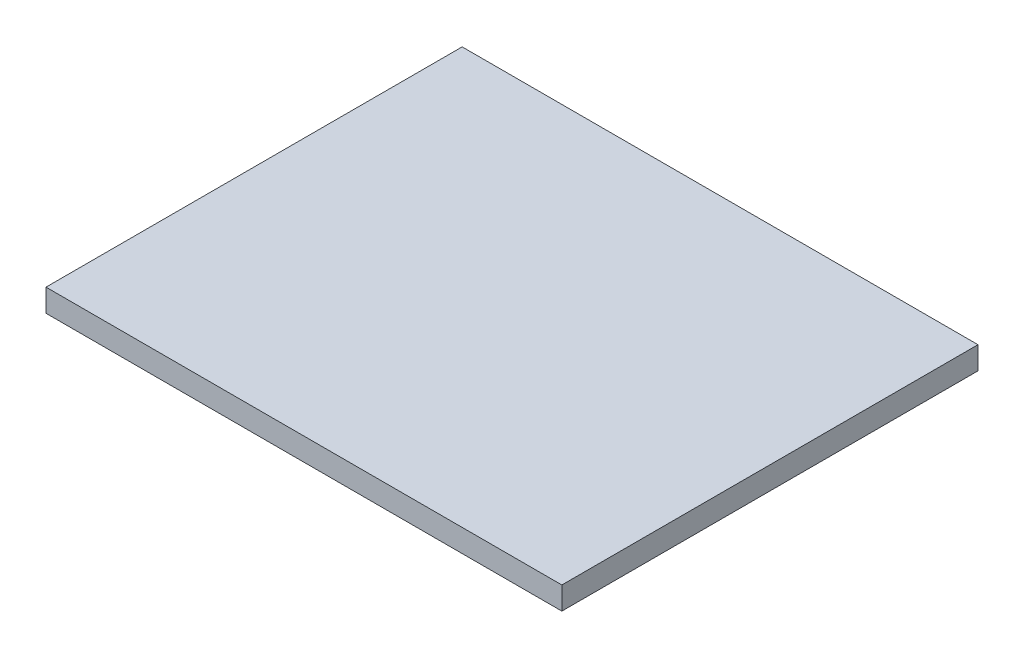
ISO-10303-21;
HEADER;
FILE_DESCRIPTION(('STEP AP214'),'2;1');
FILE_NAME('part.step','',(''),(''),'','','');
FILE_SCHEMA(('AUTOMOTIVE_DESIGN { 1 0 10303 214 1 1 1 1 }'));
ENDSEC;
DATA;
#1=APPLICATION_CONTEXT('core data for automotive mechanical design processes');
#2=APPLICATION_PROTOCOL_DEFINITION('international standard','automotive_design',2000,#1);
#3=PRODUCT_CONTEXT('',#1,'mechanical');
#4=PRODUCT('Part','Part','',(#3));
#5=PRODUCT_RELATED_PRODUCT_CATEGORY('part','',(#4));
#6=PRODUCT_DEFINITION_FORMATION('','',#4);
#7=PRODUCT_DEFINITION_CONTEXT('part definition',#1,'design');
#8=PRODUCT_DEFINITION('design','',#6,#7);
#9=PRODUCT_DEFINITION_SHAPE('','',#8);
#10=(LENGTH_UNIT() NAMED_UNIT(*) SI_UNIT(.MILLI.,.METRE.));
#11=(NAMED_UNIT(*) PLANE_ANGLE_UNIT() SI_UNIT($,.RADIAN.));
#12=(NAMED_UNIT(*) SI_UNIT($,.STERADIAN.) SOLID_ANGLE_UNIT());
#13=UNCERTAINTY_MEASURE_WITH_UNIT(LENGTH_MEASURE(1.E-05),#10,'distance_accuracy_value','');
#14=(GEOMETRIC_REPRESENTATION_CONTEXT(3) GLOBAL_UNCERTAINTY_ASSIGNED_CONTEXT((#13)) GLOBAL_UNIT_ASSIGNED_CONTEXT((#10,
#11,#12)) REPRESENTATION_CONTEXT('',''));
#15=CARTESIAN_POINT('',(0.,0.,0.));
#16=DIRECTION('',(0.,0.,1.));
#17=DIRECTION('',(1.,0.,0.));
#18=AXIS2_PLACEMENT_3D('',#15,#16,#17);
#19=CARTESIAN_POINT('',(8.66757124026153,0.762,6.99235151467105));
#20=DIRECTION('',(-1.,0.,0.));
#21=DIRECTION('',(0.,0.,1.));
#22=AXIS2_PLACEMENT_3D('',#19,#20,#21);
#23=PLANE('',#22);
#24=DIRECTION('',(0.,0.,-1.));
#25=VECTOR('',#24,1.);
#26=CARTESIAN_POINT('',(8.66757124026153,0.,6.99235151467105));
#27=LINE('',#26,#25);
#28=CARTESIAN_POINT('',(8.66757124026153,0.,6.99235151467105));
#29=VERTEX_POINT('',#28);
#30=CARTESIAN_POINT('',(8.66757124026153,0.,-6.99235151467105));
#31=VERTEX_POINT('',#30);
#32=EDGE_CURVE('E102',#29,#31,#27,.T.);
#33=ORIENTED_EDGE('',*,*,#32,.T.);
#34=DIRECTION('',(0.,-1.,0.));
#35=VECTOR('',#34,1.);
#36=CARTESIAN_POINT('',(8.66757124026153,0.762,-6.99235151467105));
#37=LINE('',#36,#35);
#38=CARTESIAN_POINT('',(8.66757124026153,0.762,-6.99235151467105));
#39=VERTEX_POINT('',#38);
#40=EDGE_CURVE('E11',#39,#31,#37,.T.);
#41=ORIENTED_EDGE('',*,*,#40,.F.);
#42=DIRECTION('',(0.,0.,-1.));
#43=VECTOR('',#42,1.);
#44=CARTESIAN_POINT('',(8.66757124026153,0.762,6.99235151467105));
#45=LINE('',#44,#43);
#46=CARTESIAN_POINT('',(8.66757124026153,0.762,6.99235151467105));
#47=VERTEX_POINT('',#46);
#48=EDGE_CURVE('E90',#47,#39,#45,.T.);
#49=ORIENTED_EDGE('',*,*,#48,.F.);
#50=DIRECTION('',(0.,-1.,0.));
#51=VECTOR('',#50,1.);
#52=CARTESIAN_POINT('',(8.66757124026153,0.762,6.99235151467105));
#53=LINE('',#52,#51);
#54=EDGE_CURVE('E98',#47,#29,#53,.T.);
#55=ORIENTED_EDGE('',*,*,#54,.T.);
#56=EDGE_LOOP('',(#33,#41,#49,#55));
#57=FACE_BOUND('',#56,.T.);
#58=ADVANCED_FACE('F39',(#57),#23,.F.);
#59=CARTESIAN_POINT('',(-8.66757124026154,0.762,-6.99235151467105));
#60=DIRECTION('',(0.,0.,1.));
#61=DIRECTION('',(1.,0.,0.));
#62=AXIS2_PLACEMENT_3D('',#59,#60,#61);
#63=PLANE('',#62);
#64=DIRECTION('',(-1.,0.,0.));
#65=VECTOR('',#64,1.);
#66=CARTESIAN_POINT('',(-8.66757124026154,0.,-6.99235151467105));
#67=LINE('',#66,#65);
#68=CARTESIAN_POINT('',(-8.66757124026154,0.,-6.99235151467105));
#69=VERTEX_POINT('',#68);
#70=EDGE_CURVE('E94',#31,#69,#67,.T.);
#71=ORIENTED_EDGE('',*,*,#70,.T.);
#72=DIRECTION('',(0.,-1.,0.));
#73=VECTOR('',#72,1.);
#74=CARTESIAN_POINT('',(-8.66757124026154,0.762,-6.99235151467105));
#75=LINE('',#74,#73);
#76=CARTESIAN_POINT('',(-8.66757124026154,0.762,-6.99235151467105));
#77=VERTEX_POINT('',#76);
#78=EDGE_CURVE('E47',#77,#69,#75,.T.);
#79=ORIENTED_EDGE('',*,*,#78,.F.);
#80=DIRECTION('',(-1.,0.,0.));
#81=VECTOR('',#80,1.);
#82=CARTESIAN_POINT('',(-8.66757124026154,0.762,-6.99235151467105));
#83=LINE('',#82,#81);
#84=EDGE_CURVE('E85',#39,#77,#83,.T.);
#85=ORIENTED_EDGE('',*,*,#84,.F.);
#86=ORIENTED_EDGE('',*,*,#40,.T.);
#87=EDGE_LOOP('',(#71,#79,#85,#86));
#88=FACE_BOUND('',#87,.T.);
#89=ADVANCED_FACE('F93',(#88),#63,.F.);
#90=CARTESIAN_POINT('',(-8.66757124026154,0.762,6.99235151467105));
#91=DIRECTION('',(1.,0.,0.));
#92=DIRECTION('',(0.,0.,-1.));
#93=AXIS2_PLACEMENT_3D('',#90,#91,#92);
#94=PLANE('',#93);
#95=DIRECTION('',(0.,0.,1.));
#96=VECTOR('',#95,1.);
#97=CARTESIAN_POINT('',(-8.66757124026154,0.,6.99235151467105));
#98=LINE('',#97,#96);
#99=CARTESIAN_POINT('',(-8.66757124026154,0.,6.99235151467105));
#100=VERTEX_POINT('',#99);
#101=EDGE_CURVE('E72',#69,#100,#98,.T.);
#102=ORIENTED_EDGE('',*,*,#101,.T.);
#103=DIRECTION('',(0.,-1.,0.));
#104=VECTOR('',#103,1.);
#105=CARTESIAN_POINT('',(-8.66757124026154,0.762,6.99235151467105));
#106=LINE('',#105,#104);
#107=CARTESIAN_POINT('',(-8.66757124026154,0.762,6.99235151467105));
#108=VERTEX_POINT('',#107);
#109=EDGE_CURVE('E95',#108,#100,#106,.T.);
#110=ORIENTED_EDGE('',*,*,#109,.F.);
#111=DIRECTION('',(0.,0.,1.));
#112=VECTOR('',#111,1.);
#113=CARTESIAN_POINT('',(-8.66757124026154,0.762,6.99235151467105));
#114=LINE('',#113,#112);
#115=EDGE_CURVE('E88',#77,#108,#114,.T.);
#116=ORIENTED_EDGE('',*,*,#115,.F.);
#117=ORIENTED_EDGE('',*,*,#78,.T.);
#118=EDGE_LOOP('',(#102,#110,#116,#117));
#119=FACE_BOUND('',#118,.T.);
#120=ADVANCED_FACE('F96',(#119),#94,.F.);
#121=CARTESIAN_POINT('',(-8.66757124026154,0.762,6.99235151467105));
#122=DIRECTION('',(0.,0.,-1.));
#123=DIRECTION('',(-1.,0.,0.));
#124=AXIS2_PLACEMENT_3D('',#121,#122,#123);
#125=PLANE('',#124);
#126=DIRECTION('',(1.,0.,0.));
#127=VECTOR('',#126,1.);
#128=CARTESIAN_POINT('',(-8.66757124026154,0.,6.99235151467105));
#129=LINE('',#128,#127);
#130=EDGE_CURVE('E78',#100,#29,#129,.T.);
#131=ORIENTED_EDGE('',*,*,#130,.T.);
#132=ORIENTED_EDGE('',*,*,#54,.F.);
#133=DIRECTION('',(1.,0.,0.));
#134=VECTOR('',#133,1.);
#135=CARTESIAN_POINT('',(-8.66757124026154,0.762,6.99235151467105));
#136=LINE('',#135,#134);
#137=EDGE_CURVE('E55',#108,#47,#136,.T.);
#138=ORIENTED_EDGE('',*,*,#137,.F.);
#139=ORIENTED_EDGE('',*,*,#109,.T.);
#140=EDGE_LOOP('',(#131,#132,#138,#139));
#141=FACE_BOUND('',#140,.T.);
#142=ADVANCED_FACE('F109',(#141),#125,.F.);
#143=CARTESIAN_POINT('',(0.,0.762,0.));
#144=DIRECTION('',(0.,-1.,0.));
#145=DIRECTION('',(0.,0.,-1.));
#146=AXIS2_PLACEMENT_3D('',#143,#144,#145);
#147=PLANE('',#146);
#148=ORIENTED_EDGE('',*,*,#48,.T.);
#149=ORIENTED_EDGE('',*,*,#84,.T.);
#150=ORIENTED_EDGE('',*,*,#115,.T.);
#151=ORIENTED_EDGE('',*,*,#137,.T.);
#152=EDGE_LOOP('',(#148,#149,#150,#151));
#153=FACE_BOUND('',#152,.T.);
#154=ADVANCED_FACE('F86',(#153),#147,.F.);
#155=CARTESIAN_POINT('',(0.,0.,0.));
#156=DIRECTION('',(0.,-1.,0.));
#157=DIRECTION('',(0.,0.,-1.));
#158=AXIS2_PLACEMENT_3D('',#155,#156,#157);
#159=PLANE('',#158);
#160=ORIENTED_EDGE('',*,*,#32,.F.);
#161=ORIENTED_EDGE('',*,*,#130,.F.);
#162=ORIENTED_EDGE('',*,*,#101,.F.);
#163=ORIENTED_EDGE('',*,*,#70,.F.);
#164=EDGE_LOOP('',(#160,#161,#162,#163));
#165=FACE_BOUND('',#164,.T.);
#166=ADVANCED_FACE('F112',(#165),#159,.T.);
#167=CLOSED_SHELL('',(#58,#89,#120,#142,#154,#166));
#168=MANIFOLD_SOLID_BREP('B2',#167);
#169=ADVANCED_BREP_SHAPE_REPRESENTATION('',(#18,#168),#14);
#170=SHAPE_DEFINITION_REPRESENTATION(#9,#169);
ENDSEC;
END-ISO-10303-21;
